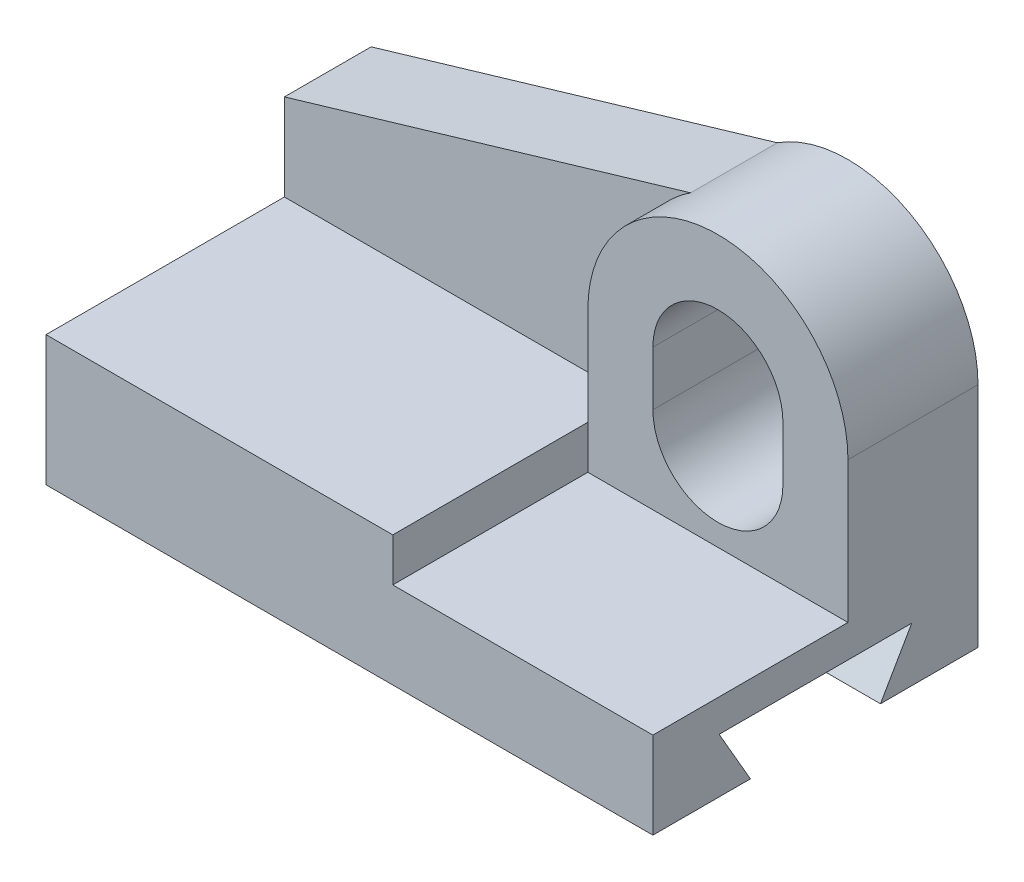
ISO-10303-21;
HEADER;
FILE_DESCRIPTION(('STEP AP214'),'2;1');
FILE_NAME('part.step','',(''),(''),'','','');
FILE_SCHEMA(('AUTOMOTIVE_DESIGN { 1 0 10303 214 1 1 1 1 }'));
ENDSEC;
DATA;
#1=APPLICATION_CONTEXT('core data for automotive mechanical design processes');
#2=APPLICATION_PROTOCOL_DEFINITION('international standard','automotive_design',2000,#1);
#3=PRODUCT_CONTEXT('',#1,'mechanical');
#4=PRODUCT('Part','Part','',(#3));
#5=PRODUCT_RELATED_PRODUCT_CATEGORY('part','',(#4));
#6=PRODUCT_DEFINITION_FORMATION('','',#4);
#7=PRODUCT_DEFINITION_CONTEXT('part definition',#1,'design');
#8=PRODUCT_DEFINITION('design','',#6,#7);
#9=PRODUCT_DEFINITION_SHAPE('','',#8);
#10=(LENGTH_UNIT() NAMED_UNIT(*) SI_UNIT(.MILLI.,.METRE.));
#11=(NAMED_UNIT(*) PLANE_ANGLE_UNIT() SI_UNIT($,.RADIAN.));
#12=(NAMED_UNIT(*) SI_UNIT($,.STERADIAN.) SOLID_ANGLE_UNIT());
#13=UNCERTAINTY_MEASURE_WITH_UNIT(LENGTH_MEASURE(1.E-05),#10,'distance_accuracy_value','');
#14=(GEOMETRIC_REPRESENTATION_CONTEXT(3) GLOBAL_UNCERTAINTY_ASSIGNED_CONTEXT((#13)) GLOBAL_UNIT_ASSIGNED_CONTEXT((#10,
#11,#12)) REPRESENTATION_CONTEXT('',''));
#15=CARTESIAN_POINT('',(0.,0.,0.));
#16=DIRECTION('',(0.,0.,1.));
#17=DIRECTION('',(1.,0.,0.));
#18=AXIS2_PLACEMENT_3D('',#15,#16,#17);
#19=CARTESIAN_POINT('',(0.,12.,0.));
#20=DIRECTION('',(0.,0.,1.));
#21=DIRECTION('',(1.,0.,0.));
#22=AXIS2_PLACEMENT_3D('',#19,#20,#21);
#23=PLANE('',#22);
#24=DIRECTION('',(0.9590177080589,0.283346141017402,0.));
#25=VECTOR('',#24,1.);
#26=CARTESIAN_POINT('',(0.,20.,0.));
#27=LINE('',#26,#25);
#28=CARTESIAN_POINT('',(0.,20.,0.));
#29=VERTEX_POINT('',#28);
#30=CARTESIAN_POINT('',(37.4783847980998,31.0731591448931,0.));
#31=VERTEX_POINT('',#30);
#32=EDGE_CURVE('E187',#29,#31,#27,.T.);
#33=ORIENTED_EDGE('',*,*,#32,.T.);
#34=CARTESIAN_POINT('',(44.,21.,0.));
#35=DIRECTION('',(0.,0.,1.));
#36=DIRECTION('',(1.,0.,0.));
#37=AXIS2_PLACEMENT_3D('',#34,#35,#36);
#38=CIRCLE('',#37,12.);
#39=CARTESIAN_POINT('',(56.,21.,0.));
#40=VERTEX_POINT('',#39);
#41=EDGE_CURVE('E213',#40,#31,#38,.T.);
#42=ORIENTED_EDGE('',*,*,#41,.F.);
#43=DIRECTION('',(0.,-1.,0.));
#44=VECTOR('',#43,1.);
#45=CARTESIAN_POINT('',(56.,12.,0.));
#46=LINE('',#45,#44);
#47=CARTESIAN_POINT('',(56.,0.,0.));
#48=VERTEX_POINT('',#47);
#49=EDGE_CURVE('E299',#40,#48,#46,.T.);
#50=ORIENTED_EDGE('',*,*,#49,.T.);
#51=DIRECTION('',(-1.,0.,0.));
#52=VECTOR('',#51,1.);
#53=CARTESIAN_POINT('',(0.,0.,0.));
#54=LINE('',#53,#52);
#55=CARTESIAN_POINT('',(0.,0.,0.));
#56=VERTEX_POINT('',#55);
#57=EDGE_CURVE('E282',#48,#56,#54,.T.);
#58=ORIENTED_EDGE('',*,*,#57,.T.);
#59=DIRECTION('',(0.,-1.,0.));
#60=VECTOR('',#59,1.);
#61=CARTESIAN_POINT('',(0.,12.,0.));
#62=LINE('',#61,#60);
#63=EDGE_CURVE('E285',#29,#56,#62,.T.);
#64=ORIENTED_EDGE('',*,*,#63,.F.);
#65=EDGE_LOOP('',(#33,#42,#50,#58,#64));
#66=FACE_BOUND('',#65,.T.);
#67=DIRECTION('',(0.,-1.,0.));
#68=VECTOR('',#67,1.);
#69=CARTESIAN_POINT('',(50.,21.,0.));
#70=LINE('',#69,#68);
#71=CARTESIAN_POINT('',(50.,21.,0.));
#72=VERTEX_POINT('',#71);
#73=CARTESIAN_POINT('',(50.,16.,0.));
#74=VERTEX_POINT('',#73);
#75=EDGE_CURVE('E169',#72,#74,#70,.T.);
#76=ORIENTED_EDGE('',*,*,#75,.F.);
#77=CARTESIAN_POINT('',(44.,21.,0.));
#78=DIRECTION('',(0.,0.,1.));
#79=DIRECTION('',(1.,0.,0.));
#80=AXIS2_PLACEMENT_3D('',#77,#78,#79);
#81=CIRCLE('',#80,6.00000000000001);
#82=CARTESIAN_POINT('',(38.,21.,0.));
#83=VERTEX_POINT('',#82);
#84=EDGE_CURVE('E191',#72,#83,#81,.T.);
#85=ORIENTED_EDGE('',*,*,#84,.T.);
#86=DIRECTION('',(0.,-1.,0.));
#87=VECTOR('',#86,1.);
#88=CARTESIAN_POINT('',(38.,21.,0.));
#89=LINE('',#88,#87);
#90=CARTESIAN_POINT('',(38.,16.,0.));
#91=VERTEX_POINT('',#90);
#92=EDGE_CURVE('E58',#83,#91,#89,.T.);
#93=ORIENTED_EDGE('',*,*,#92,.T.);
#94=CARTESIAN_POINT('',(44.,16.,0.));
#95=DIRECTION('',(0.,0.,1.));
#96=DIRECTION('',(1.,0.,0.));
#97=AXIS2_PLACEMENT_3D('',#94,#95,#96);
#98=CIRCLE('',#97,6.00000000000001);
#99=EDGE_CURVE('E179',#91,#74,#98,.T.);
#100=ORIENTED_EDGE('',*,*,#99,.T.);
#101=EDGE_LOOP('',(#76,#85,#93,#100));
#102=FACE_BOUND('',#101,.T.);
#103=ADVANCED_FACE('F43',(#66,#102),#23,.F.);
#104=CARTESIAN_POINT('',(32.,21.,12.));
#105=DIRECTION('',(0.,0.,-1.));
#106=DIRECTION('',(-1.,0.,0.));
#107=AXIS2_PLACEMENT_3D('',#104,#105,#106);
#108=PLANE('',#107);
#109=DIRECTION('',(0.,-1.,0.));
#110=VECTOR('',#109,1.);
#111=CARTESIAN_POINT('',(56.,21.,12.));
#112=LINE('',#111,#110);
#113=CARTESIAN_POINT('',(56.,21.,12.));
#114=VERTEX_POINT('',#113);
#115=CARTESIAN_POINT('',(56.,8.,12.));
#116=VERTEX_POINT('',#115);
#117=EDGE_CURVE('E223',#114,#116,#112,.T.);
#118=ORIENTED_EDGE('',*,*,#117,.F.);
#119=CARTESIAN_POINT('',(44.,21.,12.));
#120=DIRECTION('',(0.,0.,1.));
#121=DIRECTION('',(1.,0.,0.));
#122=AXIS2_PLACEMENT_3D('',#119,#120,#121);
#123=CIRCLE('',#122,12.);
#124=CARTESIAN_POINT('',(32.,21.,12.));
#125=VERTEX_POINT('',#124);
#126=EDGE_CURVE('E212',#114,#125,#123,.T.);
#127=ORIENTED_EDGE('',*,*,#126,.T.);
#128=DIRECTION('',(0.,-1.,0.));
#129=VECTOR('',#128,1.);
#130=CARTESIAN_POINT('',(32.,21.,12.));
#131=LINE('',#130,#129);
#132=CARTESIAN_POINT('',(32.,12.,12.));
#133=VERTEX_POINT('',#132);
#134=EDGE_CURVE('E229',#125,#133,#131,.T.);
#135=ORIENTED_EDGE('',*,*,#134,.T.);
#136=CARTESIAN_POINT('',(32.,8.,12.));
#137=VERTEX_POINT('',#136);
#138=EDGE_CURVE('E228',#133,#137,#131,.T.);
#139=ORIENTED_EDGE('',*,*,#138,.T.);
#140=DIRECTION('',(1.,0.,0.));
#141=VECTOR('',#140,1.);
#142=CARTESIAN_POINT('',(32.,8.,12.));
#143=LINE('',#142,#141);
#144=EDGE_CURVE('E215',#137,#116,#143,.T.);
#145=ORIENTED_EDGE('',*,*,#144,.T.);
#146=EDGE_LOOP('',(#118,#127,#135,#139,#145));
#147=FACE_BOUND('',#146,.T.);
#148=DIRECTION('',(0.,-1.,0.));
#149=VECTOR('',#148,1.);
#150=CARTESIAN_POINT('',(50.,21.,12.));
#151=LINE('',#150,#149);
#152=CARTESIAN_POINT('',(50.,21.,12.));
#153=VERTEX_POINT('',#152);
#154=CARTESIAN_POINT('',(50.,16.,12.));
#155=VERTEX_POINT('',#154);
#156=EDGE_CURVE('E66',#153,#155,#151,.T.);
#157=ORIENTED_EDGE('',*,*,#156,.T.);
#158=CARTESIAN_POINT('',(44.,16.,12.));
#159=DIRECTION('',(0.,0.,1.));
#160=DIRECTION('',(1.,0.,0.));
#161=AXIS2_PLACEMENT_3D('',#158,#159,#160);
#162=CIRCLE('',#161,6.00000000000001);
#163=CARTESIAN_POINT('',(38.,16.,12.));
#164=VERTEX_POINT('',#163);
#165=EDGE_CURVE('E186',#164,#155,#162,.T.);
#166=ORIENTED_EDGE('',*,*,#165,.F.);
#167=DIRECTION('',(0.,-1.,0.));
#168=VECTOR('',#167,1.);
#169=CARTESIAN_POINT('',(38.,21.,12.));
#170=LINE('',#169,#168);
#171=CARTESIAN_POINT('',(38.,21.,12.));
#172=VERTEX_POINT('',#171);
#173=EDGE_CURVE('E197',#172,#164,#170,.T.);
#174=ORIENTED_EDGE('',*,*,#173,.F.);
#175=CARTESIAN_POINT('',(44.,21.,12.));
#176=DIRECTION('',(0.,0.,1.));
#177=DIRECTION('',(1.,0.,0.));
#178=AXIS2_PLACEMENT_3D('',#175,#176,#177);
#179=CIRCLE('',#178,6.00000000000001);
#180=EDGE_CURVE('E180',#153,#172,#179,.T.);
#181=ORIENTED_EDGE('',*,*,#180,.F.);
#182=EDGE_LOOP('',(#157,#166,#174,#181));
#183=FACE_BOUND('',#182,.T.);
#184=ADVANCED_FACE('F322',(#147,#183),#108,.F.);
#185=CARTESIAN_POINT('',(0.,12.,0.));
#186=DIRECTION('',(0.,1.,0.));
#187=DIRECTION('',(0.,0.,1.));
#188=AXIS2_PLACEMENT_3D('',#185,#186,#187);
#189=PLANE('',#188);
#190=DIRECTION('',(0.,0.,1.));
#191=VECTOR('',#190,1.);
#192=CARTESIAN_POINT('',(32.,12.,0.));
#193=LINE('',#192,#191);
#194=CARTESIAN_POINT('',(32.,12.,8.));
#195=VERTEX_POINT('',#194);
#196=EDGE_CURVE('E244',#195,#133,#193,.T.);
#197=ORIENTED_EDGE('',*,*,#196,.F.);
#198=DIRECTION('',(-1.,0.,0.));
#199=VECTOR('',#198,1.);
#200=CARTESIAN_POINT('',(10.,12.,8.));
#201=LINE('',#200,#199);
#202=CARTESIAN_POINT('',(0.,12.,8.));
#203=VERTEX_POINT('',#202);
#204=EDGE_CURVE('E232',#195,#203,#201,.T.);
#205=ORIENTED_EDGE('',*,*,#204,.T.);
#206=DIRECTION('',(0.,0.,1.));
#207=VECTOR('',#206,1.);
#208=CARTESIAN_POINT('',(0.,12.,0.));
#209=LINE('',#208,#207);
#210=CARTESIAN_POINT('',(0.,12.,30.));
#211=VERTEX_POINT('',#210);
#212=EDGE_CURVE('E279',#203,#211,#209,.T.);
#213=ORIENTED_EDGE('',*,*,#212,.T.);
#214=DIRECTION('',(1.,0.,0.));
#215=VECTOR('',#214,1.);
#216=CARTESIAN_POINT('',(0.,12.,30.));
#217=LINE('',#216,#215);
#218=CARTESIAN_POINT('',(32.,12.,30.));
#219=VERTEX_POINT('',#218);
#220=EDGE_CURVE('E281',#211,#219,#217,.T.);
#221=ORIENTED_EDGE('',*,*,#220,.T.);
#222=EDGE_CURVE('E240',#133,#219,#193,.T.);
#223=ORIENTED_EDGE('',*,*,#222,.F.);
#224=EDGE_LOOP('',(#197,#205,#213,#221,#223));
#225=FACE_BOUND('',#224,.T.);
#226=ADVANCED_FACE('F337',(#225),#189,.T.);
#227=CARTESIAN_POINT('',(32.,21.,0.));
#228=DIRECTION('',(1.,0.,0.));
#229=DIRECTION('',(0.,0.,-1.));
#230=AXIS2_PLACEMENT_3D('',#227,#228,#229);
#231=PLANE('',#230);
#232=DIRECTION('',(0.,1.,0.));
#233=VECTOR('',#232,1.);
#234=CARTESIAN_POINT('',(32.,21.,8.));
#235=LINE('',#234,#233);
#236=CARTESIAN_POINT('',(32.,21.,8.));
#237=VERTEX_POINT('',#236);
#238=EDGE_CURVE('E210',#195,#237,#235,.T.);
#239=ORIENTED_EDGE('',*,*,#238,.F.);
#240=ORIENTED_EDGE('',*,*,#196,.T.);
#241=ORIENTED_EDGE('',*,*,#134,.F.);
#242=DIRECTION('',(0.,0.,1.));
#243=VECTOR('',#242,1.);
#244=CARTESIAN_POINT('',(32.,21.,0.));
#245=LINE('',#244,#243);
#246=EDGE_CURVE('E218',#237,#125,#245,.T.);
#247=ORIENTED_EDGE('',*,*,#246,.F.);
#248=EDGE_LOOP('',(#239,#240,#241,#247));
#249=FACE_BOUND('',#248,.T.);
#250=ADVANCED_FACE('F316',(#249),#231,.F.);
#251=CARTESIAN_POINT('',(32.,8.,0.));
#252=DIRECTION('',(-1.,0.,0.));
#253=DIRECTION('',(0.,0.,1.));
#254=AXIS2_PLACEMENT_3D('',#251,#252,#253);
#255=PLANE('',#254);
#256=ORIENTED_EDGE('',*,*,#138,.F.);
#257=ORIENTED_EDGE('',*,*,#222,.T.);
#258=DIRECTION('',(0.,1.,0.));
#259=VECTOR('',#258,1.);
#260=CARTESIAN_POINT('',(32.,8.,30.));
#261=LINE('',#260,#259);
#262=CARTESIAN_POINT('',(32.,8.,30.));
#263=VERTEX_POINT('',#262);
#264=EDGE_CURVE('E248',#263,#219,#261,.T.);
#265=ORIENTED_EDGE('',*,*,#264,.F.);
#266=DIRECTION('',(0.,0.,1.));
#267=VECTOR('',#266,1.);
#268=CARTESIAN_POINT('',(32.,8.,0.));
#269=LINE('',#268,#267);
#270=EDGE_CURVE('E243',#137,#263,#269,.T.);
#271=ORIENTED_EDGE('',*,*,#270,.F.);
#272=EDGE_LOOP('',(#256,#257,#265,#271));
#273=FACE_BOUND('',#272,.T.);
#274=ADVANCED_FACE('F351',(#273),#255,.F.);
#275=CARTESIAN_POINT('',(0.,8.,0.));
#276=DIRECTION('',(0.,1.,0.));
#277=DIRECTION('',(0.,0.,1.));
#278=AXIS2_PLACEMENT_3D('',#275,#276,#277);
#279=PLANE('',#278);
#280=DIRECTION('',(0.,0.,-1.));
#281=VECTOR('',#280,1.);
#282=CARTESIAN_POINT('',(56.,8.,30.));
#283=LINE('',#282,#281);
#284=CARTESIAN_POINT('',(56.,8.,30.));
#285=VERTEX_POINT('',#284);
#286=EDGE_CURVE('E241',#285,#116,#283,.T.);
#287=ORIENTED_EDGE('',*,*,#286,.T.);
#288=ORIENTED_EDGE('',*,*,#144,.F.);
#289=ORIENTED_EDGE('',*,*,#270,.T.);
#290=DIRECTION('',(1.,0.,0.));
#291=VECTOR('',#290,1.);
#292=CARTESIAN_POINT('',(32.,8.,30.));
#293=LINE('',#292,#291);
#294=EDGE_CURVE('E246',#263,#285,#293,.T.);
#295=ORIENTED_EDGE('',*,*,#294,.T.);
#296=EDGE_LOOP('',(#287,#288,#289,#295));
#297=FACE_BOUND('',#296,.T.);
#298=ADVANCED_FACE('F356',(#297),#279,.T.);
#299=CARTESIAN_POINT('',(56.,12.,0.));
#300=DIRECTION('',(-1.,0.,0.));
#301=DIRECTION('',(0.,0.,1.));
#302=AXIS2_PLACEMENT_3D('',#299,#300,#301);
#303=PLANE('',#302);
#304=ORIENTED_EDGE('',*,*,#286,.F.);
#305=DIRECTION('',(0.,-1.,0.));
#306=VECTOR('',#305,1.);
#307=CARTESIAN_POINT('',(56.,12.,30.));
#308=LINE('',#307,#306);
#309=CARTESIAN_POINT('',(56.,0.,30.));
#310=VERTEX_POINT('',#309);
#311=EDGE_CURVE('E301',#285,#310,#308,.T.);
#312=ORIENTED_EDGE('',*,*,#311,.T.);
#313=DIRECTION('',(0.,0.,-1.));
#314=VECTOR('',#313,1.);
#315=CARTESIAN_POINT('',(56.,0.,0.));
#316=LINE('',#315,#314);
#317=CARTESIAN_POINT('',(56.,0.,21.));
#318=VERTEX_POINT('',#317);
#319=EDGE_CURVE('E293',#310,#318,#316,.T.);
#320=ORIENTED_EDGE('',*,*,#319,.T.);
#321=DIRECTION('',(0.,0.866025403784436,0.500000000000004));
#322=VECTOR('',#321,1.);
#323=CARTESIAN_POINT('',(56.,0.,21.));
#324=LINE('',#323,#322);
#325=CARTESIAN_POINT('',(56.,5.,23.8867513459481));
#326=VERTEX_POINT('',#325);
#327=EDGE_CURVE('E253',#318,#326,#324,.T.);
#328=ORIENTED_EDGE('',*,*,#327,.T.);
#329=DIRECTION('',(0.,0.,-1.));
#330=VECTOR('',#329,1.);
#331=CARTESIAN_POINT('',(56.,5.,23.8867513459481));
#332=LINE('',#331,#330);
#333=CARTESIAN_POINT('',(56.,5.,6.11324865405182));
#334=VERTEX_POINT('',#333);
#335=EDGE_CURVE('E256',#326,#334,#332,.T.);
#336=ORIENTED_EDGE('',*,*,#335,.T.);
#337=DIRECTION('',(0.,-0.866025403784436,0.500000000000005));
#338=VECTOR('',#337,1.);
#339=CARTESIAN_POINT('',(56.,5.,6.11324865405182));
#340=LINE('',#339,#338);
#341=CARTESIAN_POINT('',(56.,0.,8.99999999999999));
#342=VERTEX_POINT('',#341);
#343=EDGE_CURVE('E260',#334,#342,#340,.T.);
#344=ORIENTED_EDGE('',*,*,#343,.T.);
#345=EDGE_CURVE('E292',#342,#48,#316,.T.);
#346=ORIENTED_EDGE('',*,*,#345,.T.);
#347=ORIENTED_EDGE('',*,*,#49,.F.);
#348=DIRECTION('',(0.,0.,-1.));
#349=VECTOR('',#348,1.);
#350=CARTESIAN_POINT('',(56.,21.,12.));
#351=LINE('',#350,#349);
#352=EDGE_CURVE('E220',#114,#40,#351,.T.);
#353=ORIENTED_EDGE('',*,*,#352,.F.);
#354=ORIENTED_EDGE('',*,*,#117,.T.);
#355=EDGE_LOOP('',(#304,#312,#320,#328,#336,#344,#346,#347,#353,#354));
#356=FACE_BOUND('',#355,.T.);
#357=ADVANCED_FACE('F355',(#356),#303,.F.);
#358=CARTESIAN_POINT('',(0.,0.,0.));
#359=DIRECTION('',(0.,1.,0.));
#360=DIRECTION('',(0.,0.,1.));
#361=AXIS2_PLACEMENT_3D('',#358,#359,#360);
#362=PLANE('',#361);
#363=DIRECTION('',(0.,0.,1.));
#364=VECTOR('',#363,1.);
#365=CARTESIAN_POINT('',(0.,0.,0.));
#366=LINE('',#365,#364);
#367=CARTESIAN_POINT('',(0.,0.,21.));
#368=VERTEX_POINT('',#367);
#369=CARTESIAN_POINT('',(0.,0.,30.));
#370=VERTEX_POINT('',#369);
#371=EDGE_CURVE('E272',#368,#370,#366,.T.);
#372=ORIENTED_EDGE('',*,*,#371,.F.);
#373=DIRECTION('',(-1.,0.,0.));
#374=VECTOR('',#373,1.);
#375=CARTESIAN_POINT('',(56.,0.,21.));
#376=LINE('',#375,#374);
#377=EDGE_CURVE('E270',#318,#368,#376,.T.);
#378=ORIENTED_EDGE('',*,*,#377,.F.);
#379=ORIENTED_EDGE('',*,*,#319,.F.);
#380=DIRECTION('',(1.,0.,0.));
#381=VECTOR('',#380,1.);
#382=CARTESIAN_POINT('',(0.,0.,30.));
#383=LINE('',#382,#381);
#384=EDGE_CURVE('E289',#370,#310,#383,.T.);
#385=ORIENTED_EDGE('',*,*,#384,.F.);
#386=EDGE_LOOP('',(#372,#378,#379,#385));
#387=FACE_BOUND('',#386,.T.);
#388=ADVANCED_FACE('F363',(#387),#362,.F.);
#389=CARTESIAN_POINT('',(0.,12.,0.));
#390=DIRECTION('',(1.,0.,0.));
#391=DIRECTION('',(0.,0.,-1.));
#392=AXIS2_PLACEMENT_3D('',#389,#390,#391);
#393=PLANE('',#392);
#394=ORIENTED_EDGE('',*,*,#63,.T.);
#395=CARTESIAN_POINT('',(0.,0.,9.));
#396=VERTEX_POINT('',#395);
#397=EDGE_CURVE('E286',#56,#396,#366,.T.);
#398=ORIENTED_EDGE('',*,*,#397,.T.);
#399=DIRECTION('',(0.,-0.866025403784436,0.500000000000005));
#400=VECTOR('',#399,1.);
#401=CARTESIAN_POINT('',(0.,5.,6.11324865405184));
#402=LINE('',#401,#400);
#403=CARTESIAN_POINT('',(0.,5.,6.11324865405184));
#404=VERTEX_POINT('',#403);
#405=EDGE_CURVE('E257',#404,#396,#402,.T.);
#406=ORIENTED_EDGE('',*,*,#405,.F.);
#407=DIRECTION('',(0.,0.,-1.));
#408=VECTOR('',#407,1.);
#409=CARTESIAN_POINT('',(0.,5.,23.8867513459482));
#410=LINE('',#409,#408);
#411=CARTESIAN_POINT('',(0.,5.,23.8867513459482));
#412=VERTEX_POINT('',#411);
#413=EDGE_CURVE('E266',#412,#404,#410,.T.);
#414=ORIENTED_EDGE('',*,*,#413,.F.);
#415=DIRECTION('',(0.,0.866025403784436,0.500000000000004));
#416=VECTOR('',#415,1.);
#417=CARTESIAN_POINT('',(0.,0.,21.));
#418=LINE('',#417,#416);
#419=EDGE_CURVE('E252',#368,#412,#418,.T.);
#420=ORIENTED_EDGE('',*,*,#419,.F.);
#421=ORIENTED_EDGE('',*,*,#371,.T.);
#422=DIRECTION('',(0.,-1.,0.));
#423=VECTOR('',#422,1.);
#424=CARTESIAN_POINT('',(0.,12.,30.));
#425=LINE('',#424,#423);
#426=EDGE_CURVE('E303',#211,#370,#425,.T.);
#427=ORIENTED_EDGE('',*,*,#426,.F.);
#428=ORIENTED_EDGE('',*,*,#212,.F.);
#429=DIRECTION('',(0.,-1.,0.));
#430=VECTOR('',#429,1.);
#431=CARTESIAN_POINT('',(0.,20.,8.));
#432=LINE('',#431,#430);
#433=CARTESIAN_POINT('',(0.,20.,8.));
#434=VERTEX_POINT('',#433);
#435=EDGE_CURVE('E236',#434,#203,#432,.T.);
#436=ORIENTED_EDGE('',*,*,#435,.F.);
#437=DIRECTION('',(0.,0.,1.));
#438=VECTOR('',#437,1.);
#439=CARTESIAN_POINT('',(0.,20.,0.));
#440=LINE('',#439,#438);
#441=EDGE_CURVE('E233',#29,#434,#440,.T.);
#442=ORIENTED_EDGE('',*,*,#441,.F.);
#443=EDGE_LOOP('',(#394,#398,#406,#414,#420,#421,#427,#428,#436,#442));
#444=FACE_BOUND('',#443,.T.);
#445=ADVANCED_FACE('F45',(#444),#393,.F.);
#446=CARTESIAN_POINT('',(0.,12.,30.));
#447=DIRECTION('',(0.,0.,-1.));
#448=DIRECTION('',(-1.,0.,0.));
#449=AXIS2_PLACEMENT_3D('',#446,#447,#448);
#450=PLANE('',#449);
#451=ORIENTED_EDGE('',*,*,#294,.F.);
#452=ORIENTED_EDGE('',*,*,#264,.T.);
#453=ORIENTED_EDGE('',*,*,#220,.F.);
#454=ORIENTED_EDGE('',*,*,#426,.T.);
#455=ORIENTED_EDGE('',*,*,#384,.T.);
#456=ORIENTED_EDGE('',*,*,#311,.F.);
#457=EDGE_LOOP('',(#451,#452,#453,#454,#455,#456));
#458=FACE_BOUND('',#457,.T.);
#459=ADVANCED_FACE('F346',(#458),#450,.F.);
#460=ORIENTED_EDGE('',*,*,#345,.F.);
#461=DIRECTION('',(-1.,0.,0.));
#462=VECTOR('',#461,1.);
#463=CARTESIAN_POINT('',(56.,0.,8.99999999999999));
#464=LINE('',#463,#462);
#465=EDGE_CURVE('E273',#342,#396,#464,.T.);
#466=ORIENTED_EDGE('',*,*,#465,.T.);
#467=ORIENTED_EDGE('',*,*,#397,.F.);
#468=ORIENTED_EDGE('',*,*,#57,.F.);
#469=EDGE_LOOP('',(#460,#466,#467,#468));
#470=FACE_BOUND('',#469,.T.);
#471=ADVANCED_FACE('F375',(#470),#362,.F.);
#472=CARTESIAN_POINT('',(56.,0.,21.));
#473=DIRECTION('',(0.,-0.500000000000004,0.866025403784436));
#474=DIRECTION('',(0.,-0.866025403784436,-0.500000000000004));
#475=AXIS2_PLACEMENT_3D('',#472,#473,#474);
#476=PLANE('',#475);
#477=ORIENTED_EDGE('',*,*,#419,.T.);
#478=DIRECTION('',(-1.,0.,0.));
#479=VECTOR('',#478,1.);
#480=CARTESIAN_POINT('',(56.,5.,23.8867513459481));
#481=LINE('',#480,#479);
#482=EDGE_CURVE('E263',#326,#412,#481,.T.);
#483=ORIENTED_EDGE('',*,*,#482,.F.);
#484=ORIENTED_EDGE('',*,*,#327,.F.);
#485=ORIENTED_EDGE('',*,*,#377,.T.);
#486=EDGE_LOOP('',(#477,#483,#484,#485));
#487=FACE_BOUND('',#486,.T.);
#488=ADVANCED_FACE('F382',(#487),#476,.F.);
#489=CARTESIAN_POINT('',(56.,5.,6.11324865405182));
#490=DIRECTION('',(0.,-0.500000000000005,-0.866025403784436));
#491=DIRECTION('',(0.,0.866025403784436,-0.500000000000005));
#492=AXIS2_PLACEMENT_3D('',#489,#490,#491);
#493=PLANE('',#492);
#494=ORIENTED_EDGE('',*,*,#405,.T.);
#495=ORIENTED_EDGE('',*,*,#465,.F.);
#496=ORIENTED_EDGE('',*,*,#343,.F.);
#497=DIRECTION('',(-1.,0.,0.));
#498=VECTOR('',#497,1.);
#499=CARTESIAN_POINT('',(56.,5.,6.11324865405182));
#500=LINE('',#499,#498);
#501=EDGE_CURVE('E276',#334,#404,#500,.T.);
#502=ORIENTED_EDGE('',*,*,#501,.T.);
#503=EDGE_LOOP('',(#494,#495,#496,#502));
#504=FACE_BOUND('',#503,.T.);
#505=ADVANCED_FACE('F402',(#504),#493,.F.);
#506=CARTESIAN_POINT('',(56.,5.,23.8867513459481));
#507=DIRECTION('',(0.,1.,0.));
#508=DIRECTION('',(0.,0.,1.));
#509=AXIS2_PLACEMENT_3D('',#506,#507,#508);
#510=PLANE('',#509);
#511=ORIENTED_EDGE('',*,*,#413,.T.);
#512=ORIENTED_EDGE('',*,*,#501,.F.);
#513=ORIENTED_EDGE('',*,*,#335,.F.);
#514=ORIENTED_EDGE('',*,*,#482,.T.);
#515=EDGE_LOOP('',(#511,#512,#513,#514));
#516=FACE_BOUND('',#515,.T.);
#517=ADVANCED_FACE('F398',(#516),#510,.F.);
#518=CARTESIAN_POINT('',(10.,20.,8.));
#519=DIRECTION('',(0.,0.,1.));
#520=DIRECTION('',(1.,0.,0.));
#521=AXIS2_PLACEMENT_3D('',#518,#519,#520);
#522=PLANE('',#521);
#523=ORIENTED_EDGE('',*,*,#204,.F.);
#524=ORIENTED_EDGE('',*,*,#238,.T.);
#525=CARTESIAN_POINT('',(44.,21.,8.));
#526=DIRECTION('',(0.,0.,-1.));
#527=DIRECTION('',(-1.,0.,0.));
#528=AXIS2_PLACEMENT_3D('',#525,#526,#527);
#529=CIRCLE('',#528,12.);
#530=CARTESIAN_POINT('',(37.4783847980998,31.0731591448931,8.));
#531=VERTEX_POINT('',#530);
#532=EDGE_CURVE('E51',#531,#237,#529,.F.);
#533=ORIENTED_EDGE('',*,*,#532,.F.);
#534=DIRECTION('',(-0.959017708058901,-0.283346141017402,0.));
#535=VECTOR('',#534,1.);
#536=CARTESIAN_POINT('',(0.,20.,8.));
#537=LINE('',#536,#535);
#538=EDGE_CURVE('E208',#531,#434,#537,.T.);
#539=ORIENTED_EDGE('',*,*,#538,.T.);
#540=ORIENTED_EDGE('',*,*,#435,.T.);
#541=EDGE_LOOP('',(#523,#524,#533,#539,#540));
#542=FACE_BOUND('',#541,.T.);
#543=ADVANCED_FACE('F333',(#542),#522,.T.);
#544=CARTESIAN_POINT('',(44.,21.,0.));
#545=DIRECTION('',(0.,0.,1.));
#546=DIRECTION('',(1.,0.,0.));
#547=AXIS2_PLACEMENT_3D('',#544,#545,#546);
#548=CYLINDRICAL_SURFACE('',#547,12.);
#549=ORIENTED_EDGE('',*,*,#41,.T.);
#550=DIRECTION('',(0.,0.,1.));
#551=VECTOR('',#550,1.);
#552=CARTESIAN_POINT('',(37.4783847980998,31.0731591448931,0.));
#553=LINE('',#552,#551);
#554=EDGE_CURVE('E12',#531,#31,#553,.F.);
#555=ORIENTED_EDGE('',*,*,#554,.F.);
#556=ORIENTED_EDGE('',*,*,#532,.T.);
#557=ORIENTED_EDGE('',*,*,#246,.T.);
#558=ORIENTED_EDGE('',*,*,#126,.F.);
#559=ORIENTED_EDGE('',*,*,#352,.T.);
#560=EDGE_LOOP('',(#549,#555,#556,#557,#558,#559));
#561=FACE_BOUND('',#560,.T.);
#562=ADVANCED_FACE('F309',(#561),#548,.T.);
#563=CARTESIAN_POINT('',(0.,20.,61.9507737833398));
#564=DIRECTION('',(-0.283346141017402,0.9590177080589,0.));
#565=DIRECTION('',(-0.959017708058901,-0.283346141017402,0.));
#566=AXIS2_PLACEMENT_3D('',#563,#564,#565);
#567=PLANE('',#566);
#568=ORIENTED_EDGE('',*,*,#538,.F.);
#569=ORIENTED_EDGE('',*,*,#554,.T.);
#570=ORIENTED_EDGE('',*,*,#32,.F.);
#571=ORIENTED_EDGE('',*,*,#441,.T.);
#572=EDGE_LOOP('',(#568,#569,#570,#571));
#573=FACE_BOUND('',#572,.T.);
#574=ADVANCED_FACE('F331',(#573),#567,.T.);
#575=CARTESIAN_POINT('',(50.,21.,0.));
#576=DIRECTION('',(-1.,0.,0.));
#577=DIRECTION('',(0.,0.,1.));
#578=AXIS2_PLACEMENT_3D('',#575,#576,#577);
#579=PLANE('',#578);
#580=ORIENTED_EDGE('',*,*,#156,.F.);
#581=DIRECTION('',(0.,0.,1.));
#582=VECTOR('',#581,1.);
#583=CARTESIAN_POINT('',(50.,21.,0.));
#584=LINE('',#583,#582);
#585=EDGE_CURVE('E174',#72,#153,#584,.T.);
#586=ORIENTED_EDGE('',*,*,#585,.F.);
#587=ORIENTED_EDGE('',*,*,#75,.T.);
#588=DIRECTION('',(0.,0.,1.));
#589=VECTOR('',#588,1.);
#590=CARTESIAN_POINT('',(50.,16.,0.));
#591=LINE('',#590,#589);
#592=EDGE_CURVE('E172',#74,#155,#591,.T.);
#593=ORIENTED_EDGE('',*,*,#592,.T.);
#594=EDGE_LOOP('',(#580,#586,#587,#593));
#595=FACE_BOUND('',#594,.T.);
#596=ADVANCED_FACE('F171',(#595),#579,.T.);
#597=CARTESIAN_POINT('',(44.,16.,0.));
#598=DIRECTION('',(0.,0.,1.));
#599=DIRECTION('',(1.,0.,0.));
#600=AXIS2_PLACEMENT_3D('',#597,#598,#599);
#601=CYLINDRICAL_SURFACE('',#600,6.00000000000001);
#602=ORIENTED_EDGE('',*,*,#165,.T.);
#603=ORIENTED_EDGE('',*,*,#592,.F.);
#604=ORIENTED_EDGE('',*,*,#99,.F.);
#605=DIRECTION('',(0.,0.,1.));
#606=VECTOR('',#605,1.);
#607=CARTESIAN_POINT('',(38.,16.,0.));
#608=LINE('',#607,#606);
#609=EDGE_CURVE('E188',#91,#164,#608,.T.);
#610=ORIENTED_EDGE('',*,*,#609,.T.);
#611=EDGE_LOOP('',(#602,#603,#604,#610));
#612=FACE_BOUND('',#611,.T.);
#613=ADVANCED_FACE('F184',(#612),#601,.F.);
#614=CARTESIAN_POINT('',(38.,21.,0.));
#615=DIRECTION('',(-1.,0.,0.));
#616=DIRECTION('',(0.,0.,1.));
#617=AXIS2_PLACEMENT_3D('',#614,#615,#616);
#618=PLANE('',#617);
#619=ORIENTED_EDGE('',*,*,#173,.T.);
#620=ORIENTED_EDGE('',*,*,#609,.F.);
#621=ORIENTED_EDGE('',*,*,#92,.F.);
#622=DIRECTION('',(0.,0.,1.));
#623=VECTOR('',#622,1.);
#624=CARTESIAN_POINT('',(38.,21.,0.));
#625=LINE('',#624,#623);
#626=EDGE_CURVE('E203',#83,#172,#625,.T.);
#627=ORIENTED_EDGE('',*,*,#626,.T.);
#628=EDGE_LOOP('',(#619,#620,#621,#627));
#629=FACE_BOUND('',#628,.T.);
#630=ADVANCED_FACE('F431',(#629),#618,.F.);
#631=CARTESIAN_POINT('',(44.,21.,0.));
#632=DIRECTION('',(0.,0.,1.));
#633=DIRECTION('',(1.,0.,0.));
#634=AXIS2_PLACEMENT_3D('',#631,#632,#633);
#635=CYLINDRICAL_SURFACE('',#634,6.00000000000001);
#636=ORIENTED_EDGE('',*,*,#180,.T.);
#637=ORIENTED_EDGE('',*,*,#626,.F.);
#638=ORIENTED_EDGE('',*,*,#84,.F.);
#639=ORIENTED_EDGE('',*,*,#585,.T.);
#640=EDGE_LOOP('',(#636,#637,#638,#639));
#641=FACE_BOUND('',#640,.T.);
#642=ADVANCED_FACE('F434',(#641),#635,.F.);
#643=CLOSED_SHELL('',(#103,#184,#226,#250,#274,#298,#357,#388,#445,#459,#471,#488,#505,#517,
#543,#562,#574,#596,#613,#630,#642));
#644=MANIFOLD_SOLID_BREP('B2',#643);
#645=ADVANCED_BREP_SHAPE_REPRESENTATION('',(#18,#644),#14);
#646=SHAPE_DEFINITION_REPRESENTATION(#9,#645);
ENDSEC;
END-ISO-10303-21;
